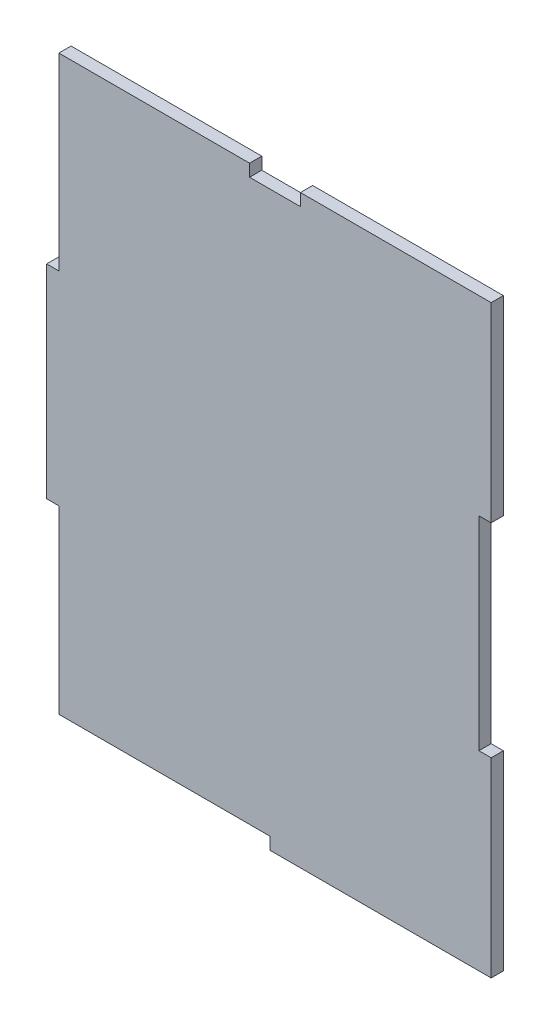
ISO-10303-21;
HEADER;
FILE_DESCRIPTION(('STEP AP214'),'2;1');
FILE_NAME('part.step','',(''),(''),'','','');
FILE_SCHEMA(('AUTOMOTIVE_DESIGN { 1 0 10303 214 1 1 1 1 }'));
ENDSEC;
DATA;
#1=APPLICATION_CONTEXT('core data for automotive mechanical design processes');
#2=APPLICATION_PROTOCOL_DEFINITION('international standard','automotive_design',2000,#1);
#3=PRODUCT_CONTEXT('',#1,'mechanical');
#4=PRODUCT('Part','Part','',(#3));
#5=PRODUCT_RELATED_PRODUCT_CATEGORY('part','',(#4));
#6=PRODUCT_DEFINITION_FORMATION('','',#4);
#7=PRODUCT_DEFINITION_CONTEXT('part definition',#1,'design');
#8=PRODUCT_DEFINITION('design','',#6,#7);
#9=PRODUCT_DEFINITION_SHAPE('','',#8);
#10=(LENGTH_UNIT() NAMED_UNIT(*) SI_UNIT(.MILLI.,.METRE.));
#11=(NAMED_UNIT(*) PLANE_ANGLE_UNIT() SI_UNIT($,.RADIAN.));
#12=(NAMED_UNIT(*) SI_UNIT($,.STERADIAN.) SOLID_ANGLE_UNIT());
#13=UNCERTAINTY_MEASURE_WITH_UNIT(LENGTH_MEASURE(1.E-05),#10,'distance_accuracy_value','');
#14=(GEOMETRIC_REPRESENTATION_CONTEXT(3) GLOBAL_UNCERTAINTY_ASSIGNED_CONTEXT((#13)) GLOBAL_UNIT_ASSIGNED_CONTEXT((#10,
#11,#12)) REPRESENTATION_CONTEXT('',''));
#15=CARTESIAN_POINT('',(0.,0.,0.));
#16=DIRECTION('',(0.,0.,1.));
#17=DIRECTION('',(1.,0.,0.));
#18=AXIS2_PLACEMENT_3D('',#15,#16,#17);
#19=CARTESIAN_POINT('',(1.68344569288387,113.391415730337,2.4));
#20=DIRECTION('',(1.,0.,0.));
#21=DIRECTION('',(0.,1.,0.));
#22=AXIS2_PLACEMENT_3D('',#19,#20,#21);
#23=PLANE('',#22);
#24=DIRECTION('',(0.,-1.,0.));
#25=VECTOR('',#24,1.);
#26=CARTESIAN_POINT('',(1.68344569288387,113.391415730337,0.));
#27=LINE('',#26,#25);
#28=CARTESIAN_POINT('',(1.68344569288387,113.391415730337,0.));
#29=VERTEX_POINT('',#28);
#30=CARTESIAN_POINT('',(1.68344569288389,76.2914157303371,0.));
#31=VERTEX_POINT('',#30);
#32=EDGE_CURVE('E189',#29,#31,#27,.T.);
#33=ORIENTED_EDGE('',*,*,#32,.T.);
#34=DIRECTION('',(0.,0.,-1.));
#35=VECTOR('',#34,1.);
#36=CARTESIAN_POINT('',(1.68344569288389,76.2914157303371,2.4));
#37=LINE('',#36,#35);
#38=CARTESIAN_POINT('',(1.68344569288389,76.2914157303371,2.4));
#39=VERTEX_POINT('',#38);
#40=EDGE_CURVE('E11',#39,#31,#37,.T.);
#41=ORIENTED_EDGE('',*,*,#40,.F.);
#42=DIRECTION('',(0.,-1.,0.));
#43=VECTOR('',#42,1.);
#44=CARTESIAN_POINT('',(1.68344569288387,113.391415730337,2.4));
#45=LINE('',#44,#43);
#46=CARTESIAN_POINT('',(1.68344569288387,113.391415730337,2.4));
#47=VERTEX_POINT('',#46);
#48=EDGE_CURVE('E223',#47,#39,#45,.T.);
#49=ORIENTED_EDGE('',*,*,#48,.F.);
#50=DIRECTION('',(0.,0.,-1.));
#51=VECTOR('',#50,1.);
#52=CARTESIAN_POINT('',(1.68344569288387,113.391415730337,2.4));
#53=LINE('',#52,#51);
#54=EDGE_CURVE('E185',#47,#29,#53,.T.);
#55=ORIENTED_EDGE('',*,*,#54,.T.);
#56=EDGE_LOOP('',(#33,#41,#49,#55));
#57=FACE_BOUND('',#56,.T.);
#58=ADVANCED_FACE('F33',(#57),#23,.F.);
#59=CARTESIAN_POINT('',(1.68344569288389,76.2914157303371,2.4));
#60=DIRECTION('',(0.,-1.,0.));
#61=DIRECTION('',(0.,0.,-1.));
#62=AXIS2_PLACEMENT_3D('',#59,#60,#61);
#63=PLANE('',#62);
#64=DIRECTION('',(-1.,0.,0.));
#65=VECTOR('',#64,1.);
#66=CARTESIAN_POINT('',(1.68344569288389,76.2914157303371,0.));
#67=LINE('',#66,#65);
#68=CARTESIAN_POINT('',(-0.716554307116118,76.2914157303371,0.));
#69=VERTEX_POINT('',#68);
#70=EDGE_CURVE('E192',#31,#69,#67,.T.);
#71=ORIENTED_EDGE('',*,*,#70,.T.);
#72=DIRECTION('',(0.,0.,-1.));
#73=VECTOR('',#72,1.);
#74=CARTESIAN_POINT('',(-0.716554307116118,76.2914157303371,2.4));
#75=LINE('',#74,#73);
#76=CARTESIAN_POINT('',(-0.716554307116118,76.2914157303371,2.4));
#77=VERTEX_POINT('',#76);
#78=EDGE_CURVE('E41',#77,#69,#75,.T.);
#79=ORIENTED_EDGE('',*,*,#78,.F.);
#80=DIRECTION('',(-1.,0.,0.));
#81=VECTOR('',#80,1.);
#82=CARTESIAN_POINT('',(1.68344569288389,76.2914157303371,2.4));
#83=LINE('',#82,#81);
#84=EDGE_CURVE('E122',#39,#77,#83,.T.);
#85=ORIENTED_EDGE('',*,*,#84,.F.);
#86=ORIENTED_EDGE('',*,*,#40,.T.);
#87=EDGE_LOOP('',(#71,#79,#85,#86));
#88=FACE_BOUND('',#87,.T.);
#89=ADVANCED_FACE('F331',(#88),#63,.F.);
#90=CARTESIAN_POINT('',(-0.716554307116118,76.2914157303371,2.4));
#91=DIRECTION('',(1.,0.,0.));
#92=DIRECTION('',(0.,1.,0.));
#93=AXIS2_PLACEMENT_3D('',#90,#91,#92);
#94=PLANE('',#93);
#95=DIRECTION('',(0.,-1.,0.));
#96=VECTOR('',#95,1.);
#97=CARTESIAN_POINT('',(-0.716554307116118,76.2914157303371,0.));
#98=LINE('',#97,#96);
#99=CARTESIAN_POINT('',(-0.716554307116299,36.2914157303371,0.));
#100=VERTEX_POINT('',#99);
#101=EDGE_CURVE('E194',#69,#100,#98,.T.);
#102=ORIENTED_EDGE('',*,*,#101,.T.);
#103=DIRECTION('',(0.,0.,-1.));
#104=VECTOR('',#103,1.);
#105=CARTESIAN_POINT('',(-0.716554307116299,36.2914157303371,2.4));
#106=LINE('',#105,#104);
#107=CARTESIAN_POINT('',(-0.716554307116299,36.2914157303371,2.4));
#108=VERTEX_POINT('',#107);
#109=EDGE_CURVE('E260',#108,#100,#106,.T.);
#110=ORIENTED_EDGE('',*,*,#109,.F.);
#111=DIRECTION('',(0.,-1.,0.));
#112=VECTOR('',#111,1.);
#113=CARTESIAN_POINT('',(-0.716554307116118,76.2914157303371,2.4));
#114=LINE('',#113,#112);
#115=EDGE_CURVE('E268',#77,#108,#114,.T.);
#116=ORIENTED_EDGE('',*,*,#115,.F.);
#117=ORIENTED_EDGE('',*,*,#78,.T.);
#118=EDGE_LOOP('',(#102,#110,#116,#117));
#119=FACE_BOUND('',#118,.T.);
#120=ADVANCED_FACE('F266',(#119),#94,.F.);
#121=CARTESIAN_POINT('',(1.68344569288389,36.2914157303371,2.4));
#122=DIRECTION('',(0.,1.,0.));
#123=DIRECTION('',(0.,0.,1.));
#124=AXIS2_PLACEMENT_3D('',#121,#122,#123);
#125=PLANE('',#124);
#126=DIRECTION('',(1.,0.,0.));
#127=VECTOR('',#126,1.);
#128=CARTESIAN_POINT('',(1.68344569288389,36.2914157303371,0.));
#129=LINE('',#128,#127);
#130=CARTESIAN_POINT('',(1.68344569288389,36.2914157303371,0.));
#131=VERTEX_POINT('',#130);
#132=EDGE_CURVE('E196',#100,#131,#129,.T.);
#133=ORIENTED_EDGE('',*,*,#132,.T.);
#134=DIRECTION('',(0.,0.,-1.));
#135=VECTOR('',#134,1.);
#136=CARTESIAN_POINT('',(1.68344569288389,36.2914157303371,2.4));
#137=LINE('',#136,#135);
#138=CARTESIAN_POINT('',(1.68344569288389,36.2914157303371,2.4));
#139=VERTEX_POINT('',#138);
#140=EDGE_CURVE('E257',#139,#131,#137,.T.);
#141=ORIENTED_EDGE('',*,*,#140,.F.);
#142=DIRECTION('',(1.,0.,0.));
#143=VECTOR('',#142,1.);
#144=CARTESIAN_POINT('',(1.68344569288389,36.2914157303371,2.4));
#145=LINE('',#144,#143);
#146=EDGE_CURVE('E286',#108,#139,#145,.T.);
#147=ORIENTED_EDGE('',*,*,#146,.F.);
#148=ORIENTED_EDGE('',*,*,#109,.T.);
#149=EDGE_LOOP('',(#133,#141,#147,#148));
#150=FACE_BOUND('',#149,.T.);
#151=ADVANCED_FACE('F277',(#150),#125,.F.);
#152=CARTESIAN_POINT('',(1.68344569288389,36.2914157303371,2.4));
#153=DIRECTION('',(1.,0.,0.));
#154=DIRECTION('',(0.,1.,0.));
#155=AXIS2_PLACEMENT_3D('',#152,#153,#154);
#156=PLANE('',#155);
#157=DIRECTION('',(0.,-1.,0.));
#158=VECTOR('',#157,1.);
#159=CARTESIAN_POINT('',(1.68344569288389,36.2914157303371,0.));
#160=LINE('',#159,#158);
#161=CARTESIAN_POINT('',(1.68344569288389,0.791415730337086,0.));
#162=VERTEX_POINT('',#161);
#163=EDGE_CURVE('E198',#131,#162,#160,.T.);
#164=ORIENTED_EDGE('',*,*,#163,.T.);
#165=DIRECTION('',(0.,0.,-1.));
#166=VECTOR('',#165,1.);
#167=CARTESIAN_POINT('',(1.68344569288389,0.791415730337086,2.4));
#168=LINE('',#167,#166);
#169=CARTESIAN_POINT('',(1.68344569288389,0.791415730337086,2.4));
#170=VERTEX_POINT('',#169);
#171=EDGE_CURVE('E254',#170,#162,#168,.T.);
#172=ORIENTED_EDGE('',*,*,#171,.F.);
#173=DIRECTION('',(0.,-1.,0.));
#174=VECTOR('',#173,1.);
#175=CARTESIAN_POINT('',(1.68344569288389,36.2914157303371,2.4));
#176=LINE('',#175,#174);
#177=EDGE_CURVE('E283',#139,#170,#176,.T.);
#178=ORIENTED_EDGE('',*,*,#177,.F.);
#179=ORIENTED_EDGE('',*,*,#140,.T.);
#180=EDGE_LOOP('',(#164,#172,#178,#179));
#181=FACE_BOUND('',#180,.T.);
#182=ADVANCED_FACE('F281',(#181),#156,.F.);
#183=CARTESIAN_POINT('',(1.68344569288389,0.791415730337086,2.4));
#184=DIRECTION('',(0.,1.,0.));
#185=DIRECTION('',(0.,0.,1.));
#186=AXIS2_PLACEMENT_3D('',#183,#184,#185);
#187=PLANE('',#186);
#188=DIRECTION('',(1.,0.,0.));
#189=VECTOR('',#188,1.);
#190=CARTESIAN_POINT('',(1.68344569288389,0.791415730337086,0.));
#191=LINE('',#190,#189);
#192=CARTESIAN_POINT('',(43.183445692884,0.791415730337086,0.));
#193=VERTEX_POINT('',#192);
#194=EDGE_CURVE('E200',#162,#193,#191,.T.);
#195=ORIENTED_EDGE('',*,*,#194,.T.);
#196=DIRECTION('',(0.,0.,-1.));
#197=VECTOR('',#196,1.);
#198=CARTESIAN_POINT('',(43.183445692884,0.791415730337086,2.4));
#199=LINE('',#198,#197);
#200=CARTESIAN_POINT('',(43.183445692884,0.791415730337086,2.4));
#201=VERTEX_POINT('',#200);
#202=EDGE_CURVE('E251',#201,#193,#199,.T.);
#203=ORIENTED_EDGE('',*,*,#202,.F.);
#204=DIRECTION('',(1.,0.,0.));
#205=VECTOR('',#204,1.);
#206=CARTESIAN_POINT('',(1.68344569288389,0.791415730337086,2.4));
#207=LINE('',#206,#205);
#208=EDGE_CURVE('E285',#170,#201,#207,.T.);
#209=ORIENTED_EDGE('',*,*,#208,.F.);
#210=ORIENTED_EDGE('',*,*,#171,.T.);
#211=EDGE_LOOP('',(#195,#203,#209,#210));
#212=FACE_BOUND('',#211,.T.);
#213=ADVANCED_FACE('F344',(#212),#187,.F.);
#214=CARTESIAN_POINT('',(43.183445692884,0.791415730337086,2.4));
#215=DIRECTION('',(1.,0.,0.));
#216=DIRECTION('',(0.,0.,-1.));
#217=AXIS2_PLACEMENT_3D('',#214,#215,#216);
#218=PLANE('',#217);
#219=DIRECTION('',(0.,-1.,0.));
#220=VECTOR('',#219,1.);
#221=CARTESIAN_POINT('',(43.183445692884,0.791415730337086,0.));
#222=LINE('',#221,#220);
#223=CARTESIAN_POINT('',(43.183445692884,-1.6085842696629,0.));
#224=VERTEX_POINT('',#223);
#225=EDGE_CURVE('E202',#193,#224,#222,.T.);
#226=ORIENTED_EDGE('',*,*,#225,.T.);
#227=DIRECTION('',(0.,0.,-1.));
#228=VECTOR('',#227,1.);
#229=CARTESIAN_POINT('',(43.183445692884,-1.6085842696629,2.4));
#230=LINE('',#229,#228);
#231=CARTESIAN_POINT('',(43.183445692884,-1.6085842696629,2.4));
#232=VERTEX_POINT('',#231);
#233=EDGE_CURVE('E248',#232,#224,#230,.T.);
#234=ORIENTED_EDGE('',*,*,#233,.F.);
#235=DIRECTION('',(0.,-1.,0.));
#236=VECTOR('',#235,1.);
#237=CARTESIAN_POINT('',(43.183445692884,0.791415730337086,2.4));
#238=LINE('',#237,#236);
#239=EDGE_CURVE('E288',#201,#232,#238,.T.);
#240=ORIENTED_EDGE('',*,*,#239,.F.);
#241=ORIENTED_EDGE('',*,*,#202,.T.);
#242=EDGE_LOOP('',(#226,#234,#240,#241));
#243=FACE_BOUND('',#242,.T.);
#244=ADVANCED_FACE('F347',(#243),#218,.F.);
#245=CARTESIAN_POINT('',(43.183445692884,-1.6085842696629,2.4));
#246=DIRECTION('',(0.,1.,0.));
#247=DIRECTION('',(0.,0.,1.));
#248=AXIS2_PLACEMENT_3D('',#245,#246,#247);
#249=PLANE('',#248);
#250=DIRECTION('',(1.,0.,0.));
#251=VECTOR('',#250,1.);
#252=CARTESIAN_POINT('',(43.183445692884,-1.6085842696629,0.));
#253=LINE('',#252,#251);
#254=CARTESIAN_POINT('',(86.6834456928839,-1.6085842696629,0.));
#255=VERTEX_POINT('',#254);
#256=EDGE_CURVE('E204',#224,#255,#253,.T.);
#257=ORIENTED_EDGE('',*,*,#256,.T.);
#258=DIRECTION('',(0.,0.,-1.));
#259=VECTOR('',#258,1.);
#260=CARTESIAN_POINT('',(86.6834456928839,-1.6085842696629,2.4));
#261=LINE('',#260,#259);
#262=CARTESIAN_POINT('',(86.6834456928839,-1.6085842696629,2.4));
#263=VERTEX_POINT('',#262);
#264=EDGE_CURVE('E245',#263,#255,#261,.T.);
#265=ORIENTED_EDGE('',*,*,#264,.F.);
#266=DIRECTION('',(1.,0.,0.));
#267=VECTOR('',#266,1.);
#268=CARTESIAN_POINT('',(43.183445692884,-1.6085842696629,2.4));
#269=LINE('',#268,#267);
#270=EDGE_CURVE('E294',#232,#263,#269,.T.);
#271=ORIENTED_EDGE('',*,*,#270,.F.);
#272=ORIENTED_EDGE('',*,*,#233,.T.);
#273=EDGE_LOOP('',(#257,#265,#271,#272));
#274=FACE_BOUND('',#273,.T.);
#275=ADVANCED_FACE('F351',(#274),#249,.F.);
#276=CARTESIAN_POINT('',(86.6834456928839,35.8914157303372,2.4));
#277=DIRECTION('',(-1.,0.,0.));
#278=DIRECTION('',(0.,0.,1.));
#279=AXIS2_PLACEMENT_3D('',#276,#277,#278);
#280=PLANE('',#279);
#281=DIRECTION('',(0.,1.,0.));
#282=VECTOR('',#281,1.);
#283=CARTESIAN_POINT('',(86.6834456928839,35.8914157303372,0.));
#284=LINE('',#283,#282);
#285=CARTESIAN_POINT('',(86.6834456928839,35.8914157303372,0.));
#286=VERTEX_POINT('',#285);
#287=EDGE_CURVE('E206',#255,#286,#284,.T.);
#288=ORIENTED_EDGE('',*,*,#287,.T.);
#289=DIRECTION('',(0.,0.,-1.));
#290=VECTOR('',#289,1.);
#291=CARTESIAN_POINT('',(86.6834456928839,35.8914157303372,2.4));
#292=LINE('',#291,#290);
#293=CARTESIAN_POINT('',(86.6834456928839,35.8914157303372,2.4));
#294=VERTEX_POINT('',#293);
#295=EDGE_CURVE('E242',#294,#286,#292,.T.);
#296=ORIENTED_EDGE('',*,*,#295,.F.);
#297=DIRECTION('',(0.,1.,0.));
#298=VECTOR('',#297,1.);
#299=CARTESIAN_POINT('',(86.6834456928839,35.8914157303372,2.4));
#300=LINE('',#299,#298);
#301=EDGE_CURVE('E296',#263,#294,#300,.T.);
#302=ORIENTED_EDGE('',*,*,#301,.F.);
#303=ORIENTED_EDGE('',*,*,#264,.T.);
#304=EDGE_LOOP('',(#288,#296,#302,#303));
#305=FACE_BOUND('',#304,.T.);
#306=ADVANCED_FACE('F355',(#305),#280,.F.);
#307=CARTESIAN_POINT('',(86.6834456928839,35.8914157303372,2.4));
#308=DIRECTION('',(0.,-1.,0.));
#309=DIRECTION('',(0.,0.,-1.));
#310=AXIS2_PLACEMENT_3D('',#307,#308,#309);
#311=PLANE('',#310);
#312=DIRECTION('',(-1.,0.,0.));
#313=VECTOR('',#312,1.);
#314=CARTESIAN_POINT('',(86.6834456928839,35.8914157303372,0.));
#315=LINE('',#314,#313);
#316=CARTESIAN_POINT('',(84.2834456928839,35.8914157303372,0.));
#317=VERTEX_POINT('',#316);
#318=EDGE_CURVE('E208',#286,#317,#315,.T.);
#319=ORIENTED_EDGE('',*,*,#318,.T.);
#320=DIRECTION('',(0.,0.,-1.));
#321=VECTOR('',#320,1.);
#322=CARTESIAN_POINT('',(84.2834456928839,35.8914157303372,2.4));
#323=LINE('',#322,#321);
#324=CARTESIAN_POINT('',(84.2834456928839,35.8914157303372,2.4));
#325=VERTEX_POINT('',#324);
#326=EDGE_CURVE('E239',#325,#317,#323,.T.);
#327=ORIENTED_EDGE('',*,*,#326,.F.);
#328=DIRECTION('',(-1.,0.,0.));
#329=VECTOR('',#328,1.);
#330=CARTESIAN_POINT('',(86.6834456928839,35.8914157303372,2.4));
#331=LINE('',#330,#329);
#332=EDGE_CURVE('E298',#294,#325,#331,.T.);
#333=ORIENTED_EDGE('',*,*,#332,.F.);
#334=ORIENTED_EDGE('',*,*,#295,.T.);
#335=EDGE_LOOP('',(#319,#327,#333,#334));
#336=FACE_BOUND('',#335,.T.);
#337=ADVANCED_FACE('F359',(#336),#311,.F.);
#338=CARTESIAN_POINT('',(84.2834456928839,75.891415730337,2.4));
#339=DIRECTION('',(-1.,0.,0.));
#340=DIRECTION('',(0.,0.,1.));
#341=AXIS2_PLACEMENT_3D('',#338,#339,#340);
#342=PLANE('',#341);
#343=DIRECTION('',(0.,1.,0.));
#344=VECTOR('',#343,1.);
#345=CARTESIAN_POINT('',(84.2834456928839,75.891415730337,0.));
#346=LINE('',#345,#344);
#347=CARTESIAN_POINT('',(84.2834456928839,75.891415730337,0.));
#348=VERTEX_POINT('',#347);
#349=EDGE_CURVE('E210',#317,#348,#346,.T.);
#350=ORIENTED_EDGE('',*,*,#349,.T.);
#351=DIRECTION('',(0.,0.,-1.));
#352=VECTOR('',#351,1.);
#353=CARTESIAN_POINT('',(84.2834456928839,75.891415730337,2.4));
#354=LINE('',#353,#352);
#355=CARTESIAN_POINT('',(84.2834456928839,75.891415730337,2.4));
#356=VERTEX_POINT('',#355);
#357=EDGE_CURVE('E236',#356,#348,#354,.T.);
#358=ORIENTED_EDGE('',*,*,#357,.F.);
#359=DIRECTION('',(0.,1.,0.));
#360=VECTOR('',#359,1.);
#361=CARTESIAN_POINT('',(84.2834456928839,75.891415730337,2.4));
#362=LINE('',#361,#360);
#363=EDGE_CURVE('E300',#325,#356,#362,.T.);
#364=ORIENTED_EDGE('',*,*,#363,.F.);
#365=ORIENTED_EDGE('',*,*,#326,.T.);
#366=EDGE_LOOP('',(#350,#358,#364,#365));
#367=FACE_BOUND('',#366,.T.);
#368=ADVANCED_FACE('F363',(#367),#342,.F.);
#369=CARTESIAN_POINT('',(86.6834456928839,75.891415730337,2.4));
#370=DIRECTION('',(0.,1.,0.));
#371=DIRECTION('',(0.,0.,1.));
#372=AXIS2_PLACEMENT_3D('',#369,#370,#371);
#373=PLANE('',#372);
#374=DIRECTION('',(1.,0.,0.));
#375=VECTOR('',#374,1.);
#376=CARTESIAN_POINT('',(86.6834456928839,75.891415730337,0.));
#377=LINE('',#376,#375);
#378=CARTESIAN_POINT('',(86.6834456928839,75.891415730337,0.));
#379=VERTEX_POINT('',#378);
#380=EDGE_CURVE('E212',#348,#379,#377,.T.);
#381=ORIENTED_EDGE('',*,*,#380,.T.);
#382=DIRECTION('',(0.,0.,-1.));
#383=VECTOR('',#382,1.);
#384=CARTESIAN_POINT('',(86.6834456928839,75.891415730337,2.4));
#385=LINE('',#384,#383);
#386=CARTESIAN_POINT('',(86.6834456928839,75.891415730337,2.4));
#387=VERTEX_POINT('',#386);
#388=EDGE_CURVE('E233',#387,#379,#385,.T.);
#389=ORIENTED_EDGE('',*,*,#388,.F.);
#390=DIRECTION('',(1.,0.,0.));
#391=VECTOR('',#390,1.);
#392=CARTESIAN_POINT('',(86.6834456928839,75.891415730337,2.4));
#393=LINE('',#392,#391);
#394=EDGE_CURVE('E302',#356,#387,#393,.T.);
#395=ORIENTED_EDGE('',*,*,#394,.F.);
#396=ORIENTED_EDGE('',*,*,#357,.T.);
#397=EDGE_LOOP('',(#381,#389,#395,#396));
#398=FACE_BOUND('',#397,.T.);
#399=ADVANCED_FACE('F367',(#398),#373,.F.);
#400=CARTESIAN_POINT('',(86.6834456928839,113.391415730337,2.4));
#401=DIRECTION('',(-1.,0.,0.));
#402=DIRECTION('',(0.,-1.,0.));
#403=AXIS2_PLACEMENT_3D('',#400,#401,#402);
#404=PLANE('',#403);
#405=DIRECTION('',(0.,1.,0.));
#406=VECTOR('',#405,1.);
#407=CARTESIAN_POINT('',(86.6834456928839,113.391415730337,0.));
#408=LINE('',#407,#406);
#409=CARTESIAN_POINT('',(86.6834456928839,113.391415730337,0.));
#410=VERTEX_POINT('',#409);
#411=EDGE_CURVE('E214',#379,#410,#408,.T.);
#412=ORIENTED_EDGE('',*,*,#411,.T.);
#413=DIRECTION('',(0.,0.,-1.));
#414=VECTOR('',#413,1.);
#415=CARTESIAN_POINT('',(86.6834456928839,113.391415730337,2.4));
#416=LINE('',#415,#414);
#417=CARTESIAN_POINT('',(86.6834456928839,113.391415730337,2.4));
#418=VERTEX_POINT('',#417);
#419=EDGE_CURVE('E230',#418,#410,#416,.T.);
#420=ORIENTED_EDGE('',*,*,#419,.F.);
#421=DIRECTION('',(0.,1.,0.));
#422=VECTOR('',#421,1.);
#423=CARTESIAN_POINT('',(86.6834456928839,113.391415730337,2.4));
#424=LINE('',#423,#422);
#425=EDGE_CURVE('E304',#387,#418,#424,.T.);
#426=ORIENTED_EDGE('',*,*,#425,.F.);
#427=ORIENTED_EDGE('',*,*,#388,.T.);
#428=EDGE_LOOP('',(#412,#420,#426,#427));
#429=FACE_BOUND('',#428,.T.);
#430=ADVANCED_FACE('F371',(#429),#404,.F.);
#431=CARTESIAN_POINT('',(49.1834456928839,113.391415730337,2.4));
#432=DIRECTION('',(0.,-1.,0.));
#433=DIRECTION('',(0.,0.,-1.));
#434=AXIS2_PLACEMENT_3D('',#431,#432,#433);
#435=PLANE('',#434);
#436=DIRECTION('',(-1.,0.,0.));
#437=VECTOR('',#436,1.);
#438=CARTESIAN_POINT('',(49.1834456928839,113.391415730337,0.));
#439=LINE('',#438,#437);
#440=CARTESIAN_POINT('',(49.1834456928839,113.391415730337,0.));
#441=VERTEX_POINT('',#440);
#442=EDGE_CURVE('E216',#410,#441,#439,.T.);
#443=ORIENTED_EDGE('',*,*,#442,.T.);
#444=DIRECTION('',(0.,0.,-1.));
#445=VECTOR('',#444,1.);
#446=CARTESIAN_POINT('',(49.1834456928839,113.391415730337,2.4));
#447=LINE('',#446,#445);
#448=CARTESIAN_POINT('',(49.1834456928839,113.391415730337,2.4));
#449=VERTEX_POINT('',#448);
#450=EDGE_CURVE('E227',#449,#441,#447,.T.);
#451=ORIENTED_EDGE('',*,*,#450,.F.);
#452=DIRECTION('',(-1.,0.,0.));
#453=VECTOR('',#452,1.);
#454=CARTESIAN_POINT('',(49.1834456928839,113.391415730337,2.4));
#455=LINE('',#454,#453);
#456=EDGE_CURVE('E306',#418,#449,#455,.T.);
#457=ORIENTED_EDGE('',*,*,#456,.F.);
#458=ORIENTED_EDGE('',*,*,#419,.T.);
#459=EDGE_LOOP('',(#443,#451,#457,#458));
#460=FACE_BOUND('',#459,.T.);
#461=ADVANCED_FACE('F312',(#460),#435,.F.);
#462=CARTESIAN_POINT('',(49.1834456928839,113.391415730337,2.4));
#463=DIRECTION('',(1.,0.,0.));
#464=DIRECTION('',(0.,1.,0.));
#465=AXIS2_PLACEMENT_3D('',#462,#463,#464);
#466=PLANE('',#465);
#467=DIRECTION('',(0.,-1.,0.));
#468=VECTOR('',#467,1.);
#469=CARTESIAN_POINT('',(49.1834456928839,113.391415730337,0.));
#470=LINE('',#469,#468);
#471=CARTESIAN_POINT('',(49.1834456928839,110.991415730337,0.));
#472=VERTEX_POINT('',#471);
#473=EDGE_CURVE('E218',#441,#472,#470,.T.);
#474=ORIENTED_EDGE('',*,*,#473,.T.);
#475=DIRECTION('',(0.,0.,-1.));
#476=VECTOR('',#475,1.);
#477=CARTESIAN_POINT('',(49.1834456928839,110.991415730337,2.4));
#478=LINE('',#477,#476);
#479=CARTESIAN_POINT('',(49.1834456928839,110.991415730337,2.4));
#480=VERTEX_POINT('',#479);
#481=EDGE_CURVE('E180',#480,#472,#478,.T.);
#482=ORIENTED_EDGE('',*,*,#481,.F.);
#483=DIRECTION('',(0.,-1.,0.));
#484=VECTOR('',#483,1.);
#485=CARTESIAN_POINT('',(49.1834456928839,113.391415730337,2.4));
#486=LINE('',#485,#484);
#487=EDGE_CURVE('E171',#449,#480,#486,.T.);
#488=ORIENTED_EDGE('',*,*,#487,.F.);
#489=ORIENTED_EDGE('',*,*,#450,.T.);
#490=EDGE_LOOP('',(#474,#482,#488,#489));
#491=FACE_BOUND('',#490,.T.);
#492=ADVANCED_FACE('F316',(#491),#466,.F.);
#493=CARTESIAN_POINT('',(39.1834456928839,110.991415730337,2.4));
#494=DIRECTION('',(0.,-1.,0.));
#495=DIRECTION('',(0.,0.,-1.));
#496=AXIS2_PLACEMENT_3D('',#493,#494,#495);
#497=PLANE('',#496);
#498=DIRECTION('',(-1.,0.,0.));
#499=VECTOR('',#498,1.);
#500=CARTESIAN_POINT('',(39.1834456928839,110.991415730337,0.));
#501=LINE('',#500,#499);
#502=CARTESIAN_POINT('',(39.1834456928839,110.991415730337,0.));
#503=VERTEX_POINT('',#502);
#504=EDGE_CURVE('E179',#472,#503,#501,.T.);
#505=ORIENTED_EDGE('',*,*,#504,.T.);
#506=DIRECTION('',(0.,0.,-1.));
#507=VECTOR('',#506,1.);
#508=CARTESIAN_POINT('',(39.1834456928839,110.991415730337,2.4));
#509=LINE('',#508,#507);
#510=CARTESIAN_POINT('',(39.1834456928839,110.991415730337,2.4));
#511=VERTEX_POINT('',#510);
#512=EDGE_CURVE('E176',#511,#503,#509,.T.);
#513=ORIENTED_EDGE('',*,*,#512,.F.);
#514=DIRECTION('',(-1.,0.,0.));
#515=VECTOR('',#514,1.);
#516=CARTESIAN_POINT('',(39.1834456928839,110.991415730337,2.4));
#517=LINE('',#516,#515);
#518=EDGE_CURVE('E165',#480,#511,#517,.T.);
#519=ORIENTED_EDGE('',*,*,#518,.F.);
#520=ORIENTED_EDGE('',*,*,#481,.T.);
#521=EDGE_LOOP('',(#505,#513,#519,#520));
#522=FACE_BOUND('',#521,.T.);
#523=ADVANCED_FACE('F177',(#522),#497,.F.);
#524=CARTESIAN_POINT('',(39.1834456928839,113.391415730337,2.4));
#525=DIRECTION('',(-1.,0.,0.));
#526=DIRECTION('',(0.,-1.,0.));
#527=AXIS2_PLACEMENT_3D('',#524,#525,#526);
#528=PLANE('',#527);
#529=DIRECTION('',(0.,1.,0.));
#530=VECTOR('',#529,1.);
#531=CARTESIAN_POINT('',(39.1834456928839,113.391415730337,0.));
#532=LINE('',#531,#530);
#533=CARTESIAN_POINT('',(39.1834456928839,113.391415730337,0.));
#534=VERTEX_POINT('',#533);
#535=EDGE_CURVE('E108',#503,#534,#532,.T.);
#536=ORIENTED_EDGE('',*,*,#535,.T.);
#537=DIRECTION('',(0.,0.,-1.));
#538=VECTOR('',#537,1.);
#539=CARTESIAN_POINT('',(39.1834456928839,113.391415730337,2.4));
#540=LINE('',#539,#538);
#541=CARTESIAN_POINT('',(39.1834456928839,113.391415730337,2.4));
#542=VERTEX_POINT('',#541);
#543=EDGE_CURVE('E181',#542,#534,#540,.T.);
#544=ORIENTED_EDGE('',*,*,#543,.F.);
#545=DIRECTION('',(0.,1.,0.));
#546=VECTOR('',#545,1.);
#547=CARTESIAN_POINT('',(39.1834456928839,113.391415730337,2.4));
#548=LINE('',#547,#546);
#549=EDGE_CURVE('E169',#511,#542,#548,.T.);
#550=ORIENTED_EDGE('',*,*,#549,.F.);
#551=ORIENTED_EDGE('',*,*,#512,.T.);
#552=EDGE_LOOP('',(#536,#544,#550,#551));
#553=FACE_BOUND('',#552,.T.);
#554=ADVANCED_FACE('F183',(#553),#528,.F.);
#555=CARTESIAN_POINT('',(1.68344569288387,113.391415730337,2.4));
#556=DIRECTION('',(0.,-1.,0.));
#557=DIRECTION('',(0.,0.,-1.));
#558=AXIS2_PLACEMENT_3D('',#555,#556,#557);
#559=PLANE('',#558);
#560=DIRECTION('',(-1.,0.,0.));
#561=VECTOR('',#560,1.);
#562=CARTESIAN_POINT('',(1.68344569288387,113.391415730337,0.));
#563=LINE('',#562,#561);
#564=EDGE_CURVE('E114',#534,#29,#563,.T.);
#565=ORIENTED_EDGE('',*,*,#564,.T.);
#566=ORIENTED_EDGE('',*,*,#54,.F.);
#567=DIRECTION('',(-1.,0.,0.));
#568=VECTOR('',#567,1.);
#569=CARTESIAN_POINT('',(1.68344569288387,113.391415730337,2.4));
#570=LINE('',#569,#568);
#571=EDGE_CURVE('E49',#542,#47,#570,.T.);
#572=ORIENTED_EDGE('',*,*,#571,.F.);
#573=ORIENTED_EDGE('',*,*,#543,.T.);
#574=EDGE_LOOP('',(#565,#566,#572,#573));
#575=FACE_BOUND('',#574,.T.);
#576=ADVANCED_FACE('F320',(#575),#559,.F.);
#577=CARTESIAN_POINT('',(0.,0.,2.4));
#578=DIRECTION('',(0.,0.,-1.));
#579=DIRECTION('',(-1.,0.,0.));
#580=AXIS2_PLACEMENT_3D('',#577,#578,#579);
#581=PLANE('',#580);
#582=ORIENTED_EDGE('',*,*,#48,.T.);
#583=ORIENTED_EDGE('',*,*,#84,.T.);
#584=ORIENTED_EDGE('',*,*,#115,.T.);
#585=ORIENTED_EDGE('',*,*,#146,.T.);
#586=ORIENTED_EDGE('',*,*,#177,.T.);
#587=ORIENTED_EDGE('',*,*,#208,.T.);
#588=ORIENTED_EDGE('',*,*,#239,.T.);
#589=ORIENTED_EDGE('',*,*,#270,.T.);
#590=ORIENTED_EDGE('',*,*,#301,.T.);
#591=ORIENTED_EDGE('',*,*,#332,.T.);
#592=ORIENTED_EDGE('',*,*,#363,.T.);
#593=ORIENTED_EDGE('',*,*,#394,.T.);
#594=ORIENTED_EDGE('',*,*,#425,.T.);
#595=ORIENTED_EDGE('',*,*,#456,.T.);
#596=ORIENTED_EDGE('',*,*,#487,.T.);
#597=ORIENTED_EDGE('',*,*,#518,.T.);
#598=ORIENTED_EDGE('',*,*,#549,.T.);
#599=ORIENTED_EDGE('',*,*,#571,.T.);
#600=EDGE_LOOP('',(#582,#583,#584,#585,#586,#587,#588,#589,#590,#591,#592,#593,#594,#595,#596,
#597,#598,#599));
#601=FACE_BOUND('',#600,.T.);
#602=ADVANCED_FACE('F167',(#601),#581,.F.);
#603=CARTESIAN_POINT('',(0.,0.,0.));
#604=DIRECTION('',(0.,0.,-1.));
#605=DIRECTION('',(-1.,0.,0.));
#606=AXIS2_PLACEMENT_3D('',#603,#604,#605);
#607=PLANE('',#606);
#608=ORIENTED_EDGE('',*,*,#32,.F.);
#609=ORIENTED_EDGE('',*,*,#564,.F.);
#610=ORIENTED_EDGE('',*,*,#535,.F.);
#611=ORIENTED_EDGE('',*,*,#504,.F.);
#612=ORIENTED_EDGE('',*,*,#473,.F.);
#613=ORIENTED_EDGE('',*,*,#442,.F.);
#614=ORIENTED_EDGE('',*,*,#411,.F.);
#615=ORIENTED_EDGE('',*,*,#380,.F.);
#616=ORIENTED_EDGE('',*,*,#349,.F.);
#617=ORIENTED_EDGE('',*,*,#318,.F.);
#618=ORIENTED_EDGE('',*,*,#287,.F.);
#619=ORIENTED_EDGE('',*,*,#256,.F.);
#620=ORIENTED_EDGE('',*,*,#225,.F.);
#621=ORIENTED_EDGE('',*,*,#194,.F.);
#622=ORIENTED_EDGE('',*,*,#163,.F.);
#623=ORIENTED_EDGE('',*,*,#132,.F.);
#624=ORIENTED_EDGE('',*,*,#101,.F.);
#625=ORIENTED_EDGE('',*,*,#70,.F.);
#626=EDGE_LOOP('',(#608,#609,#610,#611,#612,#613,#614,#615,#616,#617,#618,#619,#620,#621,#622,
#623,#624,#625));
#627=FACE_BOUND('',#626,.T.);
#628=ADVANCED_FACE('F272',(#627),#607,.T.);
#629=CLOSED_SHELL('',(#58,#89,#120,#151,#182,#213,#244,#275,#306,#337,#368,#399,#430,#461,#492,
#523,#554,#576,#602,#628));
#630=MANIFOLD_SOLID_BREP('B2',#629);
#631=ADVANCED_BREP_SHAPE_REPRESENTATION('',(#18,#630),#14);
#632=SHAPE_DEFINITION_REPRESENTATION(#9,#631);
ENDSEC;
END-ISO-10303-21;
